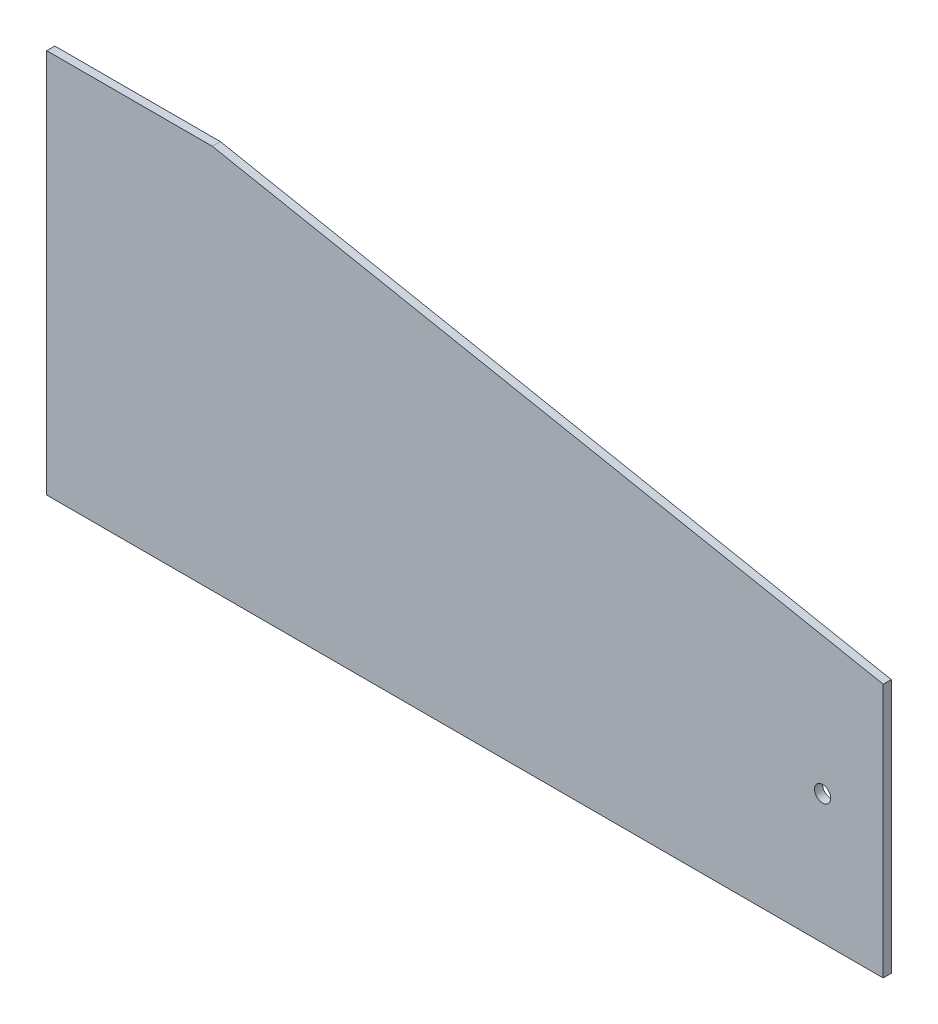
ISO-10303-21;
HEADER;
FILE_DESCRIPTION(('STEP AP214'),'2;1');
FILE_NAME('part.step','',(''),(''),'','','');
FILE_SCHEMA(('AUTOMOTIVE_DESIGN { 1 0 10303 214 1 1 1 1 }'));
ENDSEC;
DATA;
#1=APPLICATION_CONTEXT('core data for automotive mechanical design processes');
#2=APPLICATION_PROTOCOL_DEFINITION('international standard','automotive_design',2000,#1);
#3=PRODUCT_CONTEXT('',#1,'mechanical');
#4=PRODUCT('Part','Part','',(#3));
#5=PRODUCT_RELATED_PRODUCT_CATEGORY('part','',(#4));
#6=PRODUCT_DEFINITION_FORMATION('','',#4);
#7=PRODUCT_DEFINITION_CONTEXT('part definition',#1,'design');
#8=PRODUCT_DEFINITION('design','',#6,#7);
#9=PRODUCT_DEFINITION_SHAPE('','',#8);
#10=(LENGTH_UNIT() NAMED_UNIT(*) SI_UNIT(.MILLI.,.METRE.));
#11=(NAMED_UNIT(*) PLANE_ANGLE_UNIT() SI_UNIT($,.RADIAN.));
#12=(NAMED_UNIT(*) SI_UNIT($,.STERADIAN.) SOLID_ANGLE_UNIT());
#13=UNCERTAINTY_MEASURE_WITH_UNIT(LENGTH_MEASURE(1.E-05),#10,'distance_accuracy_value','');
#14=(GEOMETRIC_REPRESENTATION_CONTEXT(3) GLOBAL_UNCERTAINTY_ASSIGNED_CONTEXT((#13)) GLOBAL_UNIT_ASSIGNED_CONTEXT((#10,
#11,#12)) REPRESENTATION_CONTEXT('',''));
#15=CARTESIAN_POINT('',(0.,0.,0.));
#16=DIRECTION('',(0.,0.,1.));
#17=DIRECTION('',(1.,0.,0.));
#18=AXIS2_PLACEMENT_3D('',#15,#16,#17);
#19=CARTESIAN_POINT('',(1315.,4.91338006875447E-12,12.7));
#20=DIRECTION('',(0.,1.,0.));
#21=DIRECTION('',(-1.,0.,0.));
#22=AXIS2_PLACEMENT_3D('',#19,#20,#21);
#23=PLANE('',#22);
#24=DIRECTION('',(1.,0.,0.));
#25=VECTOR('',#24,1.);
#26=CARTESIAN_POINT('',(1315.,4.91338006875447E-12,0.));
#27=LINE('',#26,#25);
#28=CARTESIAN_POINT('',(0.,0.,0.));
#29=VERTEX_POINT('',#28);
#30=CARTESIAN_POINT('',(1315.,4.91338006875447E-12,0.));
#31=VERTEX_POINT('',#30);
#32=EDGE_CURVE('E118',#29,#31,#27,.T.);
#33=ORIENTED_EDGE('',*,*,#32,.T.);
#34=DIRECTION('',(0.,0.,-1.));
#35=VECTOR('',#34,1.);
#36=CARTESIAN_POINT('',(1315.,4.91338006875447E-12,12.7));
#37=LINE('',#36,#35);
#38=CARTESIAN_POINT('',(1315.,4.91338006875447E-12,12.7));
#39=VERTEX_POINT('',#38);
#40=EDGE_CURVE('E11',#39,#31,#37,.T.);
#41=ORIENTED_EDGE('',*,*,#40,.F.);
#42=DIRECTION('',(1.,0.,0.));
#43=VECTOR('',#42,1.);
#44=CARTESIAN_POINT('',(1315.,4.91338006875447E-12,12.7));
#45=LINE('',#44,#43);
#46=CARTESIAN_POINT('',(0.,0.,12.7));
#47=VERTEX_POINT('',#46);
#48=EDGE_CURVE('E131',#47,#39,#45,.T.);
#49=ORIENTED_EDGE('',*,*,#48,.F.);
#50=DIRECTION('',(0.,0.,-1.));
#51=VECTOR('',#50,1.);
#52=CARTESIAN_POINT('',(0.,0.,12.7));
#53=LINE('',#52,#51);
#54=EDGE_CURVE('E114',#47,#29,#53,.T.);
#55=ORIENTED_EDGE('',*,*,#54,.T.);
#56=EDGE_LOOP('',(#33,#41,#49,#55));
#57=FACE_BOUND('',#56,.T.);
#58=ADVANCED_FACE('F38',(#57),#23,.F.);
#59=CARTESIAN_POINT('',(1315.,400.000000000005,12.7));
#60=DIRECTION('',(-1.,0.,0.));
#61=DIRECTION('',(0.,0.,1.));
#62=AXIS2_PLACEMENT_3D('',#59,#60,#61);
#63=PLANE('',#62);
#64=DIRECTION('',(0.,1.,0.));
#65=VECTOR('',#64,1.);
#66=CARTESIAN_POINT('',(1315.,400.000000000005,0.));
#67=LINE('',#66,#65);
#68=CARTESIAN_POINT('',(1315.,400.000000000005,0.));
#69=VERTEX_POINT('',#68);
#70=EDGE_CURVE('E122',#31,#69,#67,.T.);
#71=ORIENTED_EDGE('',*,*,#70,.T.);
#72=DIRECTION('',(0.,0.,-1.));
#73=VECTOR('',#72,1.);
#74=CARTESIAN_POINT('',(1315.,400.000000000005,12.7));
#75=LINE('',#74,#73);
#76=CARTESIAN_POINT('',(1315.,400.000000000005,12.7));
#77=VERTEX_POINT('',#76);
#78=EDGE_CURVE('E48',#77,#69,#75,.T.);
#79=ORIENTED_EDGE('',*,*,#78,.F.);
#80=DIRECTION('',(0.,1.,0.));
#81=VECTOR('',#80,1.);
#82=CARTESIAN_POINT('',(1315.,400.000000000005,12.7));
#83=LINE('',#82,#81);
#84=EDGE_CURVE('E90',#39,#77,#83,.T.);
#85=ORIENTED_EDGE('',*,*,#84,.F.);
#86=ORIENTED_EDGE('',*,*,#40,.T.);
#87=EDGE_LOOP('',(#71,#79,#85,#86));
#88=FACE_BOUND('',#87,.T.);
#89=ADVANCED_FACE('F155',(#88),#63,.F.);
#90=CARTESIAN_POINT('',(260.366426726098,604.999999999999,12.7));
#91=DIRECTION('',(-0.190808995376542,-0.981627183447665,0.));
#92=DIRECTION('',(0.981627183447665,-0.190808995376542,0.));
#93=AXIS2_PLACEMENT_3D('',#90,#91,#92);
#94=PLANE('',#93);
#95=DIRECTION('',(-0.981627183447665,0.190808995376542,0.));
#96=VECTOR('',#95,1.);
#97=CARTESIAN_POINT('',(260.366426726098,604.999999999999,0.));
#98=LINE('',#97,#96);
#99=CARTESIAN_POINT('',(260.366426726098,604.999999999999,0.));
#100=VERTEX_POINT('',#99);
#101=EDGE_CURVE('E106',#69,#100,#98,.T.);
#102=ORIENTED_EDGE('',*,*,#101,.T.);
#103=DIRECTION('',(0.,0.,-1.));
#104=VECTOR('',#103,1.);
#105=CARTESIAN_POINT('',(260.366426726098,604.999999999999,12.7));
#106=LINE('',#105,#104);
#107=CARTESIAN_POINT('',(260.366426726098,604.999999999999,12.7));
#108=VERTEX_POINT('',#107);
#109=EDGE_CURVE('E103',#108,#100,#106,.T.);
#110=ORIENTED_EDGE('',*,*,#109,.F.);
#111=DIRECTION('',(-0.981627183447665,0.190808995376542,0.));
#112=VECTOR('',#111,1.);
#113=CARTESIAN_POINT('',(260.366426726098,604.999999999999,12.7));
#114=LINE('',#113,#112);
#115=EDGE_CURVE('E94',#77,#108,#114,.T.);
#116=ORIENTED_EDGE('',*,*,#115,.F.);
#117=ORIENTED_EDGE('',*,*,#78,.T.);
#118=EDGE_LOOP('',(#102,#110,#116,#117));
#119=FACE_BOUND('',#118,.T.);
#120=ADVANCED_FACE('F104',(#119),#94,.F.);
#121=CARTESIAN_POINT('',(0.,605.,12.7));
#122=DIRECTION('',(0.,-1.,0.));
#123=DIRECTION('',(1.,0.,0.));
#124=AXIS2_PLACEMENT_3D('',#121,#122,#123);
#125=PLANE('',#124);
#126=DIRECTION('',(-1.,0.,0.));
#127=VECTOR('',#126,1.);
#128=CARTESIAN_POINT('',(0.,605.,0.));
#129=LINE('',#128,#127);
#130=CARTESIAN_POINT('',(0.,605.,0.));
#131=VERTEX_POINT('',#130);
#132=EDGE_CURVE('E76',#100,#131,#129,.T.);
#133=ORIENTED_EDGE('',*,*,#132,.T.);
#134=DIRECTION('',(0.,0.,-1.));
#135=VECTOR('',#134,1.);
#136=CARTESIAN_POINT('',(0.,605.,12.7));
#137=LINE('',#136,#135);
#138=CARTESIAN_POINT('',(0.,605.,12.7));
#139=VERTEX_POINT('',#138);
#140=EDGE_CURVE('E108',#139,#131,#137,.T.);
#141=ORIENTED_EDGE('',*,*,#140,.F.);
#142=DIRECTION('',(-1.,0.,0.));
#143=VECTOR('',#142,1.);
#144=CARTESIAN_POINT('',(0.,605.,12.7));
#145=LINE('',#144,#143);
#146=EDGE_CURVE('E98',#108,#139,#145,.T.);
#147=ORIENTED_EDGE('',*,*,#146,.F.);
#148=ORIENTED_EDGE('',*,*,#109,.T.);
#149=EDGE_LOOP('',(#133,#141,#147,#148));
#150=FACE_BOUND('',#149,.T.);
#151=ADVANCED_FACE('F110',(#150),#125,.F.);
#152=CARTESIAN_POINT('',(0.,0.,12.7));
#153=DIRECTION('',(1.,0.,0.));
#154=DIRECTION('',(0.,0.,-1.));
#155=AXIS2_PLACEMENT_3D('',#152,#153,#154);
#156=PLANE('',#155);
#157=DIRECTION('',(0.,-1.,0.));
#158=VECTOR('',#157,1.);
#159=CARTESIAN_POINT('',(0.,0.,0.));
#160=LINE('',#159,#158);
#161=EDGE_CURVE('E82',#131,#29,#160,.T.);
#162=ORIENTED_EDGE('',*,*,#161,.T.);
#163=ORIENTED_EDGE('',*,*,#54,.F.);
#164=DIRECTION('',(0.,-1.,0.));
#165=VECTOR('',#164,1.);
#166=CARTESIAN_POINT('',(0.,0.,12.7));
#167=LINE('',#166,#165);
#168=EDGE_CURVE('E56',#139,#47,#167,.T.);
#169=ORIENTED_EDGE('',*,*,#168,.F.);
#170=ORIENTED_EDGE('',*,*,#140,.T.);
#171=EDGE_LOOP('',(#162,#163,#169,#170));
#172=FACE_BOUND('',#171,.T.);
#173=ADVANCED_FACE('F143',(#172),#156,.F.);
#174=CARTESIAN_POINT('',(0.,0.,12.7));
#175=DIRECTION('',(0.,0.,-1.));
#176=DIRECTION('',(-1.,0.,0.));
#177=AXIS2_PLACEMENT_3D('',#174,#175,#176);
#178=PLANE('',#177);
#179=CARTESIAN_POINT('',(1219.75,203.2,12.7));
#180=DIRECTION('',(0.,0.,1.));
#181=DIRECTION('',(1.,0.,0.));
#182=AXIS2_PLACEMENT_3D('',#179,#180,#181);
#183=CIRCLE('',#182,12.6999999999999);
#184=CARTESIAN_POINT('',(1232.45,203.2,12.7));
#185=VERTEX_POINT('',#184);
#186=EDGE_CURVE('E206',#185,#185,#183,.T.);
#187=ORIENTED_EDGE('',*,*,#186,.F.);
#188=EDGE_LOOP('',(#187));
#189=FACE_BOUND('',#188,.T.);
#190=ORIENTED_EDGE('',*,*,#48,.T.);
#191=ORIENTED_EDGE('',*,*,#84,.T.);
#192=ORIENTED_EDGE('',*,*,#115,.T.);
#193=ORIENTED_EDGE('',*,*,#146,.T.);
#194=ORIENTED_EDGE('',*,*,#168,.T.);
#195=EDGE_LOOP('',(#190,#191,#192,#193,#194));
#196=FACE_BOUND('',#195,.T.);
#197=ADVANCED_FACE('F96',(#189,#196),#178,.F.);
#198=CARTESIAN_POINT('',(0.,0.,0.));
#199=DIRECTION('',(0.,0.,-1.));
#200=DIRECTION('',(-1.,0.,0.));
#201=AXIS2_PLACEMENT_3D('',#198,#199,#200);
#202=PLANE('',#201);
#203=CARTESIAN_POINT('',(1219.75,203.2,0.));
#204=DIRECTION('',(0.,0.,-1.));
#205=DIRECTION('',(-1.,0.,0.));
#206=AXIS2_PLACEMENT_3D('',#203,#204,#205);
#207=CIRCLE('',#206,12.6999999999999);
#208=CARTESIAN_POINT('',(1207.05,203.2,0.));
#209=VERTEX_POINT('',#208);
#210=EDGE_CURVE('E41',#209,#209,#207,.T.);
#211=ORIENTED_EDGE('',*,*,#210,.F.);
#212=EDGE_LOOP('',(#211));
#213=FACE_BOUND('',#212,.T.);
#214=ORIENTED_EDGE('',*,*,#32,.F.);
#215=ORIENTED_EDGE('',*,*,#161,.F.);
#216=ORIENTED_EDGE('',*,*,#132,.F.);
#217=ORIENTED_EDGE('',*,*,#101,.F.);
#218=ORIENTED_EDGE('',*,*,#70,.F.);
#219=EDGE_LOOP('',(#214,#215,#216,#217,#218));
#220=FACE_BOUND('',#219,.T.);
#221=ADVANCED_FACE('F139',(#213,#220),#202,.T.);
#222=CARTESIAN_POINT('',(1219.75,203.2,-88.9));
#223=DIRECTION('',(0.,0.,1.));
#224=DIRECTION('',(1.,0.,0.));
#225=AXIS2_PLACEMENT_3D('',#222,#223,#224);
#226=CYLINDRICAL_SURFACE('',#225,12.6999999999999);
#227=ORIENTED_EDGE('',*,*,#210,.T.);
#228=EDGE_LOOP('',(#227));
#229=FACE_BOUND('',#228,.T.);
#230=ORIENTED_EDGE('',*,*,#186,.T.);
#231=EDGE_LOOP('',(#230));
#232=FACE_BOUND('',#231,.T.);
#233=ADVANCED_FACE('F188',(#229,#232),#226,.F.);
#234=CLOSED_SHELL('',(#58,#89,#120,#151,#173,#197,#221,#233));
#235=MANIFOLD_SOLID_BREP('B2',#234);
#236=ADVANCED_BREP_SHAPE_REPRESENTATION('',(#18,#235),#14);
#237=SHAPE_DEFINITION_REPRESENTATION(#9,#236);
ENDSEC;
END-ISO-10303-21;
